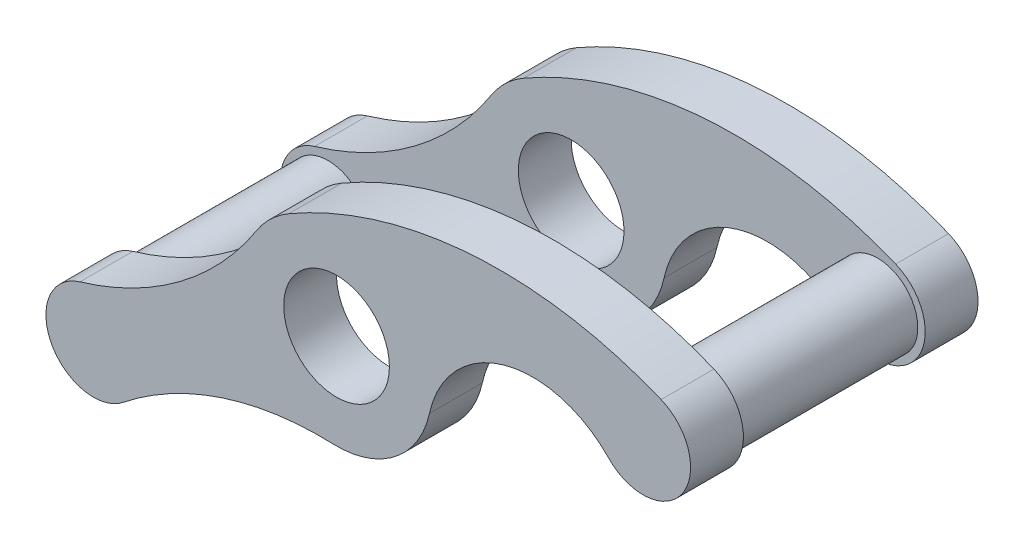
ISO-10303-21;
HEADER;
FILE_DESCRIPTION(('STEP AP214'),'2;1');
FILE_NAME('part.step','',(''),(''),'','','');
FILE_SCHEMA(('AUTOMOTIVE_DESIGN { 1 0 10303 214 1 1 1 1 }'));
ENDSEC;
DATA;
#1=APPLICATION_CONTEXT('core data for automotive mechanical design processes');
#2=APPLICATION_PROTOCOL_DEFINITION('international standard','automotive_design',2000,#1);
#3=PRODUCT_CONTEXT('',#1,'mechanical');
#4=PRODUCT('Part','Part','',(#3));
#5=PRODUCT_RELATED_PRODUCT_CATEGORY('part','',(#4));
#6=PRODUCT_DEFINITION_FORMATION('','',#4);
#7=PRODUCT_DEFINITION_CONTEXT('part definition',#1,'design');
#8=PRODUCT_DEFINITION('design','',#6,#7);
#9=PRODUCT_DEFINITION_SHAPE('','',#8);
#10=(LENGTH_UNIT() NAMED_UNIT(*) SI_UNIT(.MILLI.,.METRE.));
#11=(NAMED_UNIT(*) PLANE_ANGLE_UNIT() SI_UNIT($,.RADIAN.));
#12=(NAMED_UNIT(*) SI_UNIT($,.STERADIAN.) SOLID_ANGLE_UNIT());
#13=UNCERTAINTY_MEASURE_WITH_UNIT(LENGTH_MEASURE(1.E-05),#10,'distance_accuracy_value','');
#14=(GEOMETRIC_REPRESENTATION_CONTEXT(3) GLOBAL_UNCERTAINTY_ASSIGNED_CONTEXT((#13)) GLOBAL_UNIT_ASSIGNED_CONTEXT((#10,
#11,#12)) REPRESENTATION_CONTEXT('',''));
#15=CARTESIAN_POINT('',(0.,0.,0.));
#16=DIRECTION('',(0.,0.,1.));
#17=DIRECTION('',(1.,0.,0.));
#18=AXIS2_PLACEMENT_3D('',#15,#16,#17);
#19=CARTESIAN_POINT('',(-8.20396432467236,5.26853578895534,2.5));
#20=DIRECTION('',(0.,0.,1.));
#21=DIRECTION('',(1.,0.,0.));
#22=AXIS2_PLACEMENT_3D('',#19,#20,#21);
#23=PLANE('',#22);
#24=CARTESIAN_POINT('',(14.5,3.,2.5));
#25=DIRECTION('',(0.,0.,1.));
#26=DIRECTION('',(1.,0.,0.));
#27=AXIS2_PLACEMENT_3D('',#24,#25,#26);
#28=CIRCLE('',#27,1.9);
#29=CARTESIAN_POINT('',(12.6,3.,2.5));
#30=VERTEX_POINT('',#29);
#31=EDGE_CURVE('E194',#30,#30,#28,.T.);
#32=ORIENTED_EDGE('',*,*,#31,.F.);
#33=EDGE_LOOP('',(#32));
#34=FACE_BOUND('',#33,.T.);
#35=CARTESIAN_POINT('',(-11.5,-6.,2.5));
#36=DIRECTION('',(0.,0.,1.));
#37=DIRECTION('',(1.,0.,0.));
#38=AXIS2_PLACEMENT_3D('',#35,#36,#37);
#39=CIRCLE('',#38,1.9);
#40=CARTESIAN_POINT('',(-13.4,-6.,2.5));
#41=VERTEX_POINT('',#40);
#42=EDGE_CURVE('E188',#41,#41,#39,.T.);
#43=ORIENTED_EDGE('',*,*,#42,.F.);
#44=EDGE_LOOP('',(#43));
#45=FACE_BOUND('',#44,.T.);
#46=CARTESIAN_POINT('',(-16.4079286493447,10.5370715779107,2.5));
#47=DIRECTION('',(0.,0.,-1.));
#48=DIRECTION('',(1.,0.,0.));
#49=AXIS2_PLACEMENT_3D('',#46,#47,#48);
#50=CIRCLE('',#49,15.);
#51=CARTESIAN_POINT('',(-3.7864450729257,2.43163190259477,2.5));
#52=VERTEX_POINT('',#51);
#53=CARTESIAN_POINT('',(-12.1401646064363,-3.84299066375078,2.5));
#54=VERTEX_POINT('',#53);
#55=EDGE_CURVE('E148',#52,#54,#50,.T.);
#56=ORIENTED_EDGE('',*,*,#55,.T.);
#57=CARTESIAN_POINT('',(-11.5,-6.,2.5));
#58=DIRECTION('',(0.,0.,1.));
#59=DIRECTION('',(1.,0.,0.));
#60=AXIS2_PLACEMENT_3D('',#57,#58,#59);
#61=CIRCLE('',#60,2.25);
#62=CARTESIAN_POINT('',(-10.0970196431923,-7.75901850996845,2.5));
#63=VERTEX_POINT('',#62);
#64=EDGE_CURVE('E93',#54,#63,#61,.T.);
#65=ORIENTED_EDGE('',*,*,#64,.T.);
#66=CARTESIAN_POINT('',(-0.743817264474018,-19.4858085764248,2.5));
#67=DIRECTION('',(0.,0.,-1.));
#68=DIRECTION('',(1.,0.,0.));
#69=AXIS2_PLACEMENT_3D('',#66,#67,#68);
#70=CIRCLE('',#69,15.);
#71=CARTESIAN_POINT('',(-0.171650137955542,-4.49672505609803,2.5));
#72=VERTEX_POINT('',#71);
#73=EDGE_CURVE('E163',#63,#72,#70,.T.);
#74=ORIENTED_EDGE('',*,*,#73,.T.);
#75=CARTESIAN_POINT('',(0.,0.,2.5));
#76=DIRECTION('',(0.,0.,1.));
#77=DIRECTION('',(1.,0.,0.));
#78=AXIS2_PLACEMENT_3D('',#75,#76,#77);
#79=CIRCLE('',#78,4.5);
#80=CARTESIAN_POINT('',(4.39590119601776,-0.962316307068316,2.5));
#81=VERTEX_POINT('',#80);
#82=EDGE_CURVE('E176',#72,#81,#79,.T.);
#83=ORIENTED_EDGE('',*,*,#82,.T.);
#84=CARTESIAN_POINT('',(9.28023585825972,-2.03155664825533,2.5));
#85=DIRECTION('',(0.,0.,-1.));
#86=DIRECTION('',(1.,0.,0.));
#87=AXIS2_PLACEMENT_3D('',#84,#85,#86);
#88=CIRCLE('',#87,5.);
#89=CARTESIAN_POINT('',(12.8800731973909,1.43848241950697,2.5));
#90=VERTEX_POINT('',#89);
#91=EDGE_CURVE('E115',#81,#90,#88,.T.);
#92=ORIENTED_EDGE('',*,*,#91,.T.);
#93=CARTESIAN_POINT('',(14.5,3.,2.5));
#94=DIRECTION('',(0.,0.,1.));
#95=DIRECTION('',(1.,0.,0.));
#96=AXIS2_PLACEMENT_3D('',#93,#94,#95);
#97=CIRCLE('',#96,2.25);
#98=CARTESIAN_POINT('',(15.3547441393792,5.08132468783632,2.5));
#99=VERTEX_POINT('',#98);
#100=EDGE_CURVE('E109',#90,#99,#97,.T.);
#101=ORIENTED_EDGE('',*,*,#100,.T.);
#102=CARTESIAN_POINT('',(7.7570184560087,-13.4193392040421,2.5));
#103=DIRECTION('',(0.,0.,1.));
#104=DIRECTION('',(1.,0.,0.));
#105=AXIS2_PLACEMENT_3D('',#102,#103,#104);
#106=CIRCLE('',#105,20.);
#107=CARTESIAN_POINT('',(-2.25203761626059,3.89593718827027,2.5));
#108=VERTEX_POINT('',#107);
#109=EDGE_CURVE('E113',#99,#108,#106,.T.);
#110=ORIENTED_EDGE('',*,*,#109,.T.);
#111=CARTESIAN_POINT('',(0.,0.,2.5));
#112=DIRECTION('',(0.,0.,1.));
#113=DIRECTION('',(1.,0.,0.));
#114=AXIS2_PLACEMENT_3D('',#111,#112,#113);
#115=CIRCLE('',#114,4.5);
#116=EDGE_CURVE('E49',#108,#52,#115,.T.);
#117=ORIENTED_EDGE('',*,*,#116,.T.);
#118=EDGE_LOOP('',(#56,#65,#74,#83,#92,#101,#110,#117));
#119=FACE_BOUND('',#118,.T.);
#120=CARTESIAN_POINT('',(0.,0.,2.5));
#121=DIRECTION('',(0.,0.,1.));
#122=DIRECTION('',(1.,0.,0.));
#123=AXIS2_PLACEMENT_3D('',#120,#121,#122);
#124=CIRCLE('',#123,2.5);
#125=CARTESIAN_POINT('',(2.5,0.,2.5));
#126=VERTEX_POINT('',#125);
#127=EDGE_CURVE('E137',#126,#126,#124,.T.);
#128=ORIENTED_EDGE('',*,*,#127,.F.);
#129=EDGE_LOOP('',(#128));
#130=FACE_BOUND('',#129,.T.);
#131=ADVANCED_FACE('F32',(#34,#45,#119,#130),#23,.T.);
#132=CARTESIAN_POINT('',(-8.20396432467236,5.26853578895534,0.));
#133=DIRECTION('',(0.,0.,1.));
#134=DIRECTION('',(1.,0.,0.));
#135=AXIS2_PLACEMENT_3D('',#132,#133,#134);
#136=PLANE('',#135);
#137=CARTESIAN_POINT('',(-16.4079286493447,10.5370715779107,0.));
#138=DIRECTION('',(0.,0.,-1.));
#139=DIRECTION('',(1.,0.,0.));
#140=AXIS2_PLACEMENT_3D('',#137,#138,#139);
#141=CIRCLE('',#140,15.);
#142=CARTESIAN_POINT('',(-3.7864450729257,2.43163190259477,0.));
#143=VERTEX_POINT('',#142);
#144=CARTESIAN_POINT('',(-12.1401646064363,-3.84299066375078,0.));
#145=VERTEX_POINT('',#144);
#146=EDGE_CURVE('E133',#143,#145,#141,.T.);
#147=ORIENTED_EDGE('',*,*,#146,.F.);
#148=CARTESIAN_POINT('',(0.,0.,0.));
#149=DIRECTION('',(0.,0.,1.));
#150=DIRECTION('',(1.,0.,0.));
#151=AXIS2_PLACEMENT_3D('',#148,#149,#150);
#152=CIRCLE('',#151,4.5);
#153=CARTESIAN_POINT('',(-2.25203761626059,3.89593718827027,0.));
#154=VERTEX_POINT('',#153);
#155=EDGE_CURVE('E85',#154,#143,#152,.T.);
#156=ORIENTED_EDGE('',*,*,#155,.F.);
#157=CARTESIAN_POINT('',(7.7570184560087,-13.4193392040421,0.));
#158=DIRECTION('',(0.,0.,1.));
#159=DIRECTION('',(1.,0.,0.));
#160=AXIS2_PLACEMENT_3D('',#157,#158,#159);
#161=CIRCLE('',#160,20.);
#162=CARTESIAN_POINT('',(15.3547441393792,5.08132468783632,0.));
#163=VERTEX_POINT('',#162);
#164=EDGE_CURVE('E79',#163,#154,#161,.T.);
#165=ORIENTED_EDGE('',*,*,#164,.F.);
#166=CARTESIAN_POINT('',(14.5,3.,0.));
#167=DIRECTION('',(0.,0.,1.));
#168=DIRECTION('',(1.,0.,0.));
#169=AXIS2_PLACEMENT_3D('',#166,#167,#168);
#170=CIRCLE('',#169,2.25);
#171=CARTESIAN_POINT('',(12.8800731973909,1.43848241950697,0.));
#172=VERTEX_POINT('',#171);
#173=EDGE_CURVE('E123',#172,#163,#170,.T.);
#174=ORIENTED_EDGE('',*,*,#173,.F.);
#175=CARTESIAN_POINT('',(9.28023585825972,-2.03155664825533,0.));
#176=DIRECTION('',(0.,0.,-1.));
#177=DIRECTION('',(1.,0.,0.));
#178=AXIS2_PLACEMENT_3D('',#175,#176,#177);
#179=CIRCLE('',#178,5.);
#180=CARTESIAN_POINT('',(4.39590119601776,-0.962316307068316,0.));
#181=VERTEX_POINT('',#180);
#182=EDGE_CURVE('E143',#181,#172,#179,.T.);
#183=ORIENTED_EDGE('',*,*,#182,.F.);
#184=CARTESIAN_POINT('',(0.,0.,0.));
#185=DIRECTION('',(0.,0.,1.));
#186=DIRECTION('',(1.,0.,0.));
#187=AXIS2_PLACEMENT_3D('',#184,#185,#186);
#188=CIRCLE('',#187,4.5);
#189=CARTESIAN_POINT('',(-0.171650137955542,-4.49672505609803,0.));
#190=VERTEX_POINT('',#189);
#191=EDGE_CURVE('E141',#190,#181,#188,.T.);
#192=ORIENTED_EDGE('',*,*,#191,.F.);
#193=CARTESIAN_POINT('',(-0.743817264474018,-19.4858085764248,0.));
#194=DIRECTION('',(0.,0.,-1.));
#195=DIRECTION('',(1.,0.,0.));
#196=AXIS2_PLACEMENT_3D('',#193,#194,#195);
#197=CIRCLE('',#196,15.);
#198=CARTESIAN_POINT('',(-10.0970196431923,-7.75901850996845,0.));
#199=VERTEX_POINT('',#198);
#200=EDGE_CURVE('E139',#199,#190,#197,.T.);
#201=ORIENTED_EDGE('',*,*,#200,.F.);
#202=CARTESIAN_POINT('',(-11.5,-6.,0.));
#203=DIRECTION('',(0.,0.,1.));
#204=DIRECTION('',(1.,0.,0.));
#205=AXIS2_PLACEMENT_3D('',#202,#203,#204);
#206=CIRCLE('',#205,2.25);
#207=EDGE_CURVE('E136',#145,#199,#206,.T.);
#208=ORIENTED_EDGE('',*,*,#207,.F.);
#209=EDGE_LOOP('',(#147,#156,#165,#174,#183,#192,#201,#208));
#210=FACE_BOUND('',#209,.T.);
#211=CARTESIAN_POINT('',(0.,0.,0.));
#212=DIRECTION('',(0.,0.,1.));
#213=DIRECTION('',(1.,0.,0.));
#214=AXIS2_PLACEMENT_3D('',#211,#212,#213);
#215=CIRCLE('',#214,2.5);
#216=CARTESIAN_POINT('',(2.5,0.,0.));
#217=VERTEX_POINT('',#216);
#218=EDGE_CURVE('E182',#217,#217,#215,.T.);
#219=ORIENTED_EDGE('',*,*,#218,.T.);
#220=EDGE_LOOP('',(#219));
#221=FACE_BOUND('',#220,.T.);
#222=ADVANCED_FACE('F167',(#210,#221),#136,.F.);
#223=CARTESIAN_POINT('',(-16.4079286493447,10.5370715779107,2.5));
#224=DIRECTION('',(0.,0.,-1.));
#225=DIRECTION('',(-1.,0.,0.));
#226=AXIS2_PLACEMENT_3D('',#223,#224,#225);
#227=CYLINDRICAL_SURFACE('',#226,15.);
#228=ORIENTED_EDGE('',*,*,#146,.T.);
#229=DIRECTION('',(0.,0.,-1.));
#230=VECTOR('',#229,1.);
#231=CARTESIAN_POINT('',(-12.1401646064363,-3.84299066375078,2.5));
#232=LINE('',#231,#230);
#233=EDGE_CURVE('E11',#54,#145,#232,.T.);
#234=ORIENTED_EDGE('',*,*,#233,.F.);
#235=ORIENTED_EDGE('',*,*,#55,.F.);
#236=DIRECTION('',(0.,0.,-1.));
#237=VECTOR('',#236,1.);
#238=CARTESIAN_POINT('',(-3.7864450729257,2.43163190259477,2.5));
#239=LINE('',#238,#237);
#240=EDGE_CURVE('E129',#52,#143,#239,.T.);
#241=ORIENTED_EDGE('',*,*,#240,.T.);
#242=EDGE_LOOP('',(#228,#234,#235,#241));
#243=FACE_BOUND('',#242,.T.);
#244=ADVANCED_FACE('F34',(#243),#227,.F.);
#245=CARTESIAN_POINT('',(-11.5,-6.,2.5));
#246=DIRECTION('',(0.,0.,-1.));
#247=DIRECTION('',(-1.,0.,0.));
#248=AXIS2_PLACEMENT_3D('',#245,#246,#247);
#249=CYLINDRICAL_SURFACE('',#248,2.25);
#250=ORIENTED_EDGE('',*,*,#207,.T.);
#251=DIRECTION('',(0.,0.,-1.));
#252=VECTOR('',#251,1.);
#253=CARTESIAN_POINT('',(-10.0970196431923,-7.75901850996845,2.5));
#254=LINE('',#253,#252);
#255=EDGE_CURVE('E41',#63,#199,#254,.T.);
#256=ORIENTED_EDGE('',*,*,#255,.F.);
#257=ORIENTED_EDGE('',*,*,#64,.F.);
#258=ORIENTED_EDGE('',*,*,#233,.T.);
#259=EDGE_LOOP('',(#250,#256,#257,#258));
#260=FACE_BOUND('',#259,.T.);
#261=ADVANCED_FACE('F323',(#260),#249,.T.);
#262=CARTESIAN_POINT('',(-0.743817264474018,-19.4858085764248,2.5));
#263=DIRECTION('',(0.,0.,-1.));
#264=DIRECTION('',(-1.,0.,0.));
#265=AXIS2_PLACEMENT_3D('',#262,#263,#264);
#266=CYLINDRICAL_SURFACE('',#265,15.);
#267=ORIENTED_EDGE('',*,*,#200,.T.);
#268=DIRECTION('',(0.,0.,-1.));
#269=VECTOR('',#268,1.);
#270=CARTESIAN_POINT('',(-0.171650137955542,-4.49672505609803,2.5));
#271=LINE('',#270,#269);
#272=EDGE_CURVE('E155',#72,#190,#271,.T.);
#273=ORIENTED_EDGE('',*,*,#272,.F.);
#274=ORIENTED_EDGE('',*,*,#73,.F.);
#275=ORIENTED_EDGE('',*,*,#255,.T.);
#276=EDGE_LOOP('',(#267,#273,#274,#275));
#277=FACE_BOUND('',#276,.T.);
#278=ADVANCED_FACE('F161',(#277),#266,.F.);
#279=CARTESIAN_POINT('',(0.,0.,2.5));
#280=DIRECTION('',(0.,0.,-1.));
#281=DIRECTION('',(-1.,0.,0.));
#282=AXIS2_PLACEMENT_3D('',#279,#280,#281);
#283=CYLINDRICAL_SURFACE('',#282,4.5);
#284=ORIENTED_EDGE('',*,*,#191,.T.);
#285=DIRECTION('',(0.,0.,-1.));
#286=VECTOR('',#285,1.);
#287=CARTESIAN_POINT('',(4.39590119601776,-0.962316307068316,2.5));
#288=LINE('',#287,#286);
#289=EDGE_CURVE('E152',#81,#181,#288,.T.);
#290=ORIENTED_EDGE('',*,*,#289,.F.);
#291=ORIENTED_EDGE('',*,*,#82,.F.);
#292=ORIENTED_EDGE('',*,*,#272,.T.);
#293=EDGE_LOOP('',(#284,#290,#291,#292));
#294=FACE_BOUND('',#293,.T.);
#295=ADVANCED_FACE('F172',(#294),#283,.T.);
#296=CARTESIAN_POINT('',(9.28023585825972,-2.03155664825533,2.5));
#297=DIRECTION('',(0.,0.,-1.));
#298=DIRECTION('',(-1.,0.,0.));
#299=AXIS2_PLACEMENT_3D('',#296,#297,#298);
#300=CYLINDRICAL_SURFACE('',#299,5.);
#301=ORIENTED_EDGE('',*,*,#182,.T.);
#302=DIRECTION('',(0.,0.,-1.));
#303=VECTOR('',#302,1.);
#304=CARTESIAN_POINT('',(12.8800731973909,1.43848241950697,2.5));
#305=LINE('',#304,#303);
#306=EDGE_CURVE('E124',#90,#172,#305,.T.);
#307=ORIENTED_EDGE('',*,*,#306,.F.);
#308=ORIENTED_EDGE('',*,*,#91,.F.);
#309=ORIENTED_EDGE('',*,*,#289,.T.);
#310=EDGE_LOOP('',(#301,#307,#308,#309));
#311=FACE_BOUND('',#310,.T.);
#312=ADVANCED_FACE('F175',(#311),#300,.F.);
#313=CARTESIAN_POINT('',(14.5,3.,2.5));
#314=DIRECTION('',(0.,0.,-1.));
#315=DIRECTION('',(-1.,0.,0.));
#316=AXIS2_PLACEMENT_3D('',#313,#314,#315);
#317=CYLINDRICAL_SURFACE('',#316,2.25);
#318=ORIENTED_EDGE('',*,*,#173,.T.);
#319=DIRECTION('',(0.,0.,-1.));
#320=VECTOR('',#319,1.);
#321=CARTESIAN_POINT('',(15.3547441393792,5.08132468783632,2.5));
#322=LINE('',#321,#320);
#323=EDGE_CURVE('E120',#99,#163,#322,.T.);
#324=ORIENTED_EDGE('',*,*,#323,.F.);
#325=ORIENTED_EDGE('',*,*,#100,.F.);
#326=ORIENTED_EDGE('',*,*,#306,.T.);
#327=EDGE_LOOP('',(#318,#324,#325,#326));
#328=FACE_BOUND('',#327,.T.);
#329=ADVANCED_FACE('F121',(#328),#317,.T.);
#330=CARTESIAN_POINT('',(7.7570184560087,-13.4193392040421,2.5));
#331=DIRECTION('',(0.,0.,-1.));
#332=DIRECTION('',(-1.,0.,0.));
#333=AXIS2_PLACEMENT_3D('',#330,#331,#332);
#334=CYLINDRICAL_SURFACE('',#333,20.);
#335=ORIENTED_EDGE('',*,*,#164,.T.);
#336=DIRECTION('',(0.,0.,-1.));
#337=VECTOR('',#336,1.);
#338=CARTESIAN_POINT('',(-2.25203761626059,3.89593718827027,2.5));
#339=LINE('',#338,#337);
#340=EDGE_CURVE('E125',#108,#154,#339,.T.);
#341=ORIENTED_EDGE('',*,*,#340,.F.);
#342=ORIENTED_EDGE('',*,*,#109,.F.);
#343=ORIENTED_EDGE('',*,*,#323,.T.);
#344=EDGE_LOOP('',(#335,#341,#342,#343));
#345=FACE_BOUND('',#344,.T.);
#346=ADVANCED_FACE('F127',(#345),#334,.T.);
#347=CARTESIAN_POINT('',(0.,0.,2.5));
#348=DIRECTION('',(0.,0.,-1.));
#349=DIRECTION('',(-1.,0.,0.));
#350=AXIS2_PLACEMENT_3D('',#347,#348,#349);
#351=CYLINDRICAL_SURFACE('',#350,4.5);
#352=ORIENTED_EDGE('',*,*,#155,.T.);
#353=ORIENTED_EDGE('',*,*,#240,.F.);
#354=ORIENTED_EDGE('',*,*,#116,.F.);
#355=ORIENTED_EDGE('',*,*,#340,.T.);
#356=EDGE_LOOP('',(#352,#353,#354,#355));
#357=FACE_BOUND('',#356,.T.);
#358=ADVANCED_FACE('F311',(#357),#351,.T.);
#359=CARTESIAN_POINT('',(0.,0.,2.5));
#360=DIRECTION('',(0.,0.,-1.));
#361=DIRECTION('',(-1.,0.,0.));
#362=AXIS2_PLACEMENT_3D('',#359,#360,#361);
#363=CYLINDRICAL_SURFACE('',#362,2.5);
#364=ORIENTED_EDGE('',*,*,#127,.T.);
#365=EDGE_LOOP('',(#364));
#366=FACE_BOUND('',#365,.T.);
#367=ORIENTED_EDGE('',*,*,#218,.F.);
#368=EDGE_LOOP('',(#367));
#369=FACE_BOUND('',#368,.T.);
#370=ADVANCED_FACE('F308',(#366,#369),#363,.F.);
#371=CARTESIAN_POINT('',(-11.5,-6.,11.1));
#372=DIRECTION('',(0.,0.,-1.));
#373=DIRECTION('',(-1.,0.,0.));
#374=AXIS2_PLACEMENT_3D('',#371,#372,#373);
#375=CYLINDRICAL_SURFACE('',#374,1.9);
#376=CARTESIAN_POINT('',(-11.5,-6.,11.1));
#377=DIRECTION('',(0.,0.,1.));
#378=DIRECTION('',(1.,0.,0.));
#379=AXIS2_PLACEMENT_3D('',#376,#377,#378);
#380=CIRCLE('',#379,1.9);
#381=CARTESIAN_POINT('',(-13.4,-6.,11.1));
#382=VERTEX_POINT('',#381);
#383=EDGE_CURVE('E185',#382,#382,#380,.T.);
#384=CARTESIAN_POINT('',(-13.4,-6.,11.1));
#385=CARTESIAN_POINT('',(-13.4,-6.,11.0104166666667));
#386=CARTESIAN_POINT('',(-13.4,-6.,10.9208333333333));
#387=CARTESIAN_POINT('',(-13.4,-6.,10.7416666666667));
#388=CARTESIAN_POINT('',(-13.4,-6.,10.6520833333333));
#389=CARTESIAN_POINT('',(-13.4,-6.,10.4729166666667));
#390=CARTESIAN_POINT('',(-13.4,-6.,10.3833333333333));
#391=CARTESIAN_POINT('',(-13.4,-6.,10.2041666666667));
#392=CARTESIAN_POINT('',(-13.4,-6.,10.1145833333333));
#393=CARTESIAN_POINT('',(-13.4,-6.,9.93541666666667));
#394=CARTESIAN_POINT('',(-13.4,-6.,9.84583333333333));
#395=CARTESIAN_POINT('',(-13.4,-6.,9.66666666666667));
#396=CARTESIAN_POINT('',(-13.4,-6.,9.57708333333333));
#397=CARTESIAN_POINT('',(-13.4,-6.,9.39791666666667));
#398=CARTESIAN_POINT('',(-13.4,-6.,9.30833333333333));
#399=CARTESIAN_POINT('',(-13.4,-6.,9.12916666666667));
#400=CARTESIAN_POINT('',(-13.4,-6.,9.03958333333333));
#401=CARTESIAN_POINT('',(-13.4,-6.,8.86041666666667));
#402=CARTESIAN_POINT('',(-13.4,-6.,8.77083333333333));
#403=CARTESIAN_POINT('',(-13.4,-6.,8.59166666666667));
#404=CARTESIAN_POINT('',(-13.4,-6.,8.50208333333333));
#405=CARTESIAN_POINT('',(-13.4,-6.,8.32291666666667));
#406=CARTESIAN_POINT('',(-13.4,-6.,8.23333333333333));
#407=CARTESIAN_POINT('',(-13.4,-6.,8.05416666666666));
#408=CARTESIAN_POINT('',(-13.4,-6.,7.96458333333333));
#409=CARTESIAN_POINT('',(-13.4,-6.,7.78541666666667));
#410=CARTESIAN_POINT('',(-13.4,-6.,7.69583333333333));
#411=CARTESIAN_POINT('',(-13.4,-6.,7.51666666666667));
#412=CARTESIAN_POINT('',(-13.4,-6.,7.42708333333333));
#413=CARTESIAN_POINT('',(-13.4,-6.,7.24791666666667));
#414=CARTESIAN_POINT('',(-13.4,-6.,7.15833333333333));
#415=CARTESIAN_POINT('',(-13.4,-6.,6.97916666666667));
#416=CARTESIAN_POINT('',(-13.4,-6.,6.88958333333333));
#417=CARTESIAN_POINT('',(-13.4,-6.,6.71041666666667));
#418=CARTESIAN_POINT('',(-13.4,-6.,6.62083333333333));
#419=CARTESIAN_POINT('',(-13.4,-6.,6.44166666666667));
#420=CARTESIAN_POINT('',(-13.4,-6.,6.35208333333333));
#421=CARTESIAN_POINT('',(-13.4,-6.,6.17291666666666));
#422=CARTESIAN_POINT('',(-13.4,-6.,6.08333333333333));
#423=CARTESIAN_POINT('',(-13.4,-6.,5.90416666666667));
#424=CARTESIAN_POINT('',(-13.4,-6.,5.81458333333333));
#425=CARTESIAN_POINT('',(-13.4,-6.,5.63541666666667));
#426=CARTESIAN_POINT('',(-13.4,-6.,5.54583333333333));
#427=CARTESIAN_POINT('',(-13.4,-6.,5.36666666666666));
#428=CARTESIAN_POINT('',(-13.4,-6.,5.27708333333333));
#429=CARTESIAN_POINT('',(-13.4,-6.,5.09791666666666));
#430=CARTESIAN_POINT('',(-13.4,-6.,5.00833333333333));
#431=CARTESIAN_POINT('',(-13.4,-6.,4.82916666666666));
#432=CARTESIAN_POINT('',(-13.4,-6.,4.73958333333333));
#433=CARTESIAN_POINT('',(-13.4,-6.,4.56041666666667));
#434=CARTESIAN_POINT('',(-13.4,-6.,4.47083333333333));
#435=CARTESIAN_POINT('',(-13.4,-6.,4.29166666666667));
#436=CARTESIAN_POINT('',(-13.4,-6.,4.20208333333333));
#437=CARTESIAN_POINT('',(-13.4,-6.,4.02291666666666));
#438=CARTESIAN_POINT('',(-13.4,-6.,3.93333333333333));
#439=CARTESIAN_POINT('',(-13.4,-6.,3.75416666666666));
#440=CARTESIAN_POINT('',(-13.4,-6.,3.66458333333333));
#441=CARTESIAN_POINT('',(-13.4,-6.,3.48541666666666));
#442=CARTESIAN_POINT('',(-13.4,-6.,3.39583333333333));
#443=CARTESIAN_POINT('',(-13.4,-6.,3.21666666666666));
#444=CARTESIAN_POINT('',(-13.4,-6.,3.12708333333333));
#445=CARTESIAN_POINT('',(-13.4,-6.,2.94791666666667));
#446=CARTESIAN_POINT('',(-13.4,-6.,2.85833333333333));
#447=CARTESIAN_POINT('',(-13.4,-6.,2.67916666666667));
#448=CARTESIAN_POINT('',(-13.4,-6.,2.58958333333333));
#449=CARTESIAN_POINT('',(-13.4,-6.,2.5));
#450=B_SPLINE_CURVE_WITH_KNOTS('',3,(#384,#385,#386,#387,#388,#389,#390,#391,#392,#393,#394,
#395,#396,#397,#398,#399,#400,#401,#402,#403,#404,#405,#406,#407,#408,#409,#410,#411,#412,#413,
#414,#415,#416,#417,#418,#419,#420,#421,#422,#423,#424,#425,#426,#427,#428,#429,#430,#431,#432,
#433,#434,#435,#436,#437,#438,#439,#440,#441,#442,#443,#444,#445,#446,#447,#448,#449),
.UNSPECIFIED.,.F.,.F.,(4,2,2,2,2,2,2,2,2,2,2,2,2,2,2,2,2,2,2,2,2,2,2,2,2,2,2,2,2,2,2,2,4),(0.,
0.268750000000002,0.537500000000002,0.806250000000001,1.075,1.34375,1.6125,1.88125,2.15,2.41875,
2.6875,2.95625,3.225,3.49375,3.7625,4.03125,4.3,4.56875,4.8375,5.10625,5.375,5.64375,5.9125,
6.18125,6.45,6.71875,6.9875,7.25625,7.525,7.79375,8.0625,8.33125,8.6),.UNSPECIFIED.);
#451=EDGE_CURVE('BSEAM294',#382,#41,#450,.T.);
#452=ORIENTED_EDGE('',*,*,#383,.F.);
#453=ORIENTED_EDGE('',*,*,#42,.T.);
#454=ORIENTED_EDGE('',*,*,#451,.T.);
#455=ORIENTED_EDGE('',*,*,#451,.F.);
#456=EDGE_LOOP('',(#452,#454,#453,#455));
#457=FACE_BOUND('',#456,.T.);
#458=ADVANCED_FACE('F294',(#457),#375,.T.);
#459=CARTESIAN_POINT('',(14.5,3.,11.1));
#460=DIRECTION('',(0.,0.,-1.));
#461=DIRECTION('',(-1.,0.,0.));
#462=AXIS2_PLACEMENT_3D('',#459,#460,#461);
#463=CYLINDRICAL_SURFACE('',#462,1.9);
#464=CARTESIAN_POINT('',(14.5,3.,11.1));
#465=DIRECTION('',(0.,0.,1.));
#466=DIRECTION('',(1.,0.,0.));
#467=AXIS2_PLACEMENT_3D('',#464,#465,#466);
#468=CIRCLE('',#467,1.9);
#469=CARTESIAN_POINT('',(12.6,3.,11.1));
#470=VERTEX_POINT('',#469);
#471=EDGE_CURVE('E191',#470,#470,#468,.T.);
#472=CARTESIAN_POINT('',(12.6,3.,11.1));
#473=CARTESIAN_POINT('',(12.6,3.,11.0104166666667));
#474=CARTESIAN_POINT('',(12.6,3.,10.9208333333333));
#475=CARTESIAN_POINT('',(12.6,3.,10.7416666666667));
#476=CARTESIAN_POINT('',(12.6,3.,10.6520833333333));
#477=CARTESIAN_POINT('',(12.6,3.,10.4729166666667));
#478=CARTESIAN_POINT('',(12.6,3.,10.3833333333333));
#479=CARTESIAN_POINT('',(12.6,3.,10.2041666666667));
#480=CARTESIAN_POINT('',(12.6,3.,10.1145833333333));
#481=CARTESIAN_POINT('',(12.6,3.,9.93541666666667));
#482=CARTESIAN_POINT('',(12.6,3.,9.84583333333333));
#483=CARTESIAN_POINT('',(12.6,3.,9.66666666666667));
#484=CARTESIAN_POINT('',(12.6,3.,9.57708333333333));
#485=CARTESIAN_POINT('',(12.6,3.,9.39791666666667));
#486=CARTESIAN_POINT('',(12.6,3.,9.30833333333333));
#487=CARTESIAN_POINT('',(12.6,3.,9.12916666666667));
#488=CARTESIAN_POINT('',(12.6,3.,9.03958333333333));
#489=CARTESIAN_POINT('',(12.6,3.,8.86041666666667));
#490=CARTESIAN_POINT('',(12.6,3.,8.77083333333333));
#491=CARTESIAN_POINT('',(12.6,3.,8.59166666666667));
#492=CARTESIAN_POINT('',(12.6,3.,8.50208333333333));
#493=CARTESIAN_POINT('',(12.6,3.,8.32291666666667));
#494=CARTESIAN_POINT('',(12.6,3.,8.23333333333333));
#495=CARTESIAN_POINT('',(12.6,3.,8.05416666666666));
#496=CARTESIAN_POINT('',(12.6,3.,7.96458333333333));
#497=CARTESIAN_POINT('',(12.6,3.,7.78541666666667));
#498=CARTESIAN_POINT('',(12.6,3.,7.69583333333333));
#499=CARTESIAN_POINT('',(12.6,3.,7.51666666666667));
#500=CARTESIAN_POINT('',(12.6,3.,7.42708333333333));
#501=CARTESIAN_POINT('',(12.6,3.,7.24791666666667));
#502=CARTESIAN_POINT('',(12.6,3.,7.15833333333333));
#503=CARTESIAN_POINT('',(12.6,3.,6.97916666666667));
#504=CARTESIAN_POINT('',(12.6,3.,6.88958333333333));
#505=CARTESIAN_POINT('',(12.6,3.,6.71041666666667));
#506=CARTESIAN_POINT('',(12.6,3.,6.62083333333333));
#507=CARTESIAN_POINT('',(12.6,3.,6.44166666666667));
#508=CARTESIAN_POINT('',(12.6,3.,6.35208333333333));
#509=CARTESIAN_POINT('',(12.6,3.,6.17291666666666));
#510=CARTESIAN_POINT('',(12.6,3.,6.08333333333333));
#511=CARTESIAN_POINT('',(12.6,3.,5.90416666666667));
#512=CARTESIAN_POINT('',(12.6,3.,5.81458333333333));
#513=CARTESIAN_POINT('',(12.6,3.,5.63541666666667));
#514=CARTESIAN_POINT('',(12.6,3.,5.54583333333333));
#515=CARTESIAN_POINT('',(12.6,3.,5.36666666666666));
#516=CARTESIAN_POINT('',(12.6,3.,5.27708333333333));
#517=CARTESIAN_POINT('',(12.6,3.,5.09791666666666));
#518=CARTESIAN_POINT('',(12.6,3.,5.00833333333333));
#519=CARTESIAN_POINT('',(12.6,3.,4.82916666666666));
#520=CARTESIAN_POINT('',(12.6,3.,4.73958333333333));
#521=CARTESIAN_POINT('',(12.6,3.,4.56041666666667));
#522=CARTESIAN_POINT('',(12.6,3.,4.47083333333333));
#523=CARTESIAN_POINT('',(12.6,3.,4.29166666666667));
#524=CARTESIAN_POINT('',(12.6,3.,4.20208333333333));
#525=CARTESIAN_POINT('',(12.6,3.,4.02291666666666));
#526=CARTESIAN_POINT('',(12.6,3.,3.93333333333333));
#527=CARTESIAN_POINT('',(12.6,3.,3.75416666666666));
#528=CARTESIAN_POINT('',(12.6,3.,3.66458333333333));
#529=CARTESIAN_POINT('',(12.6,3.,3.48541666666666));
#530=CARTESIAN_POINT('',(12.6,3.,3.39583333333333));
#531=CARTESIAN_POINT('',(12.6,3.,3.21666666666666));
#532=CARTESIAN_POINT('',(12.6,3.,3.12708333333333));
#533=CARTESIAN_POINT('',(12.6,3.,2.94791666666667));
#534=CARTESIAN_POINT('',(12.6,3.,2.85833333333333));
#535=CARTESIAN_POINT('',(12.6,3.,2.67916666666667));
#536=CARTESIAN_POINT('',(12.6,3.,2.58958333333333));
#537=CARTESIAN_POINT('',(12.6,3.,2.5));
#538=B_SPLINE_CURVE_WITH_KNOTS('',3,(#472,#473,#474,#475,#476,#477,#478,#479,#480,#481,#482,
#483,#484,#485,#486,#487,#488,#489,#490,#491,#492,#493,#494,#495,#496,#497,#498,#499,#500,#501,
#502,#503,#504,#505,#506,#507,#508,#509,#510,#511,#512,#513,#514,#515,#516,#517,#518,#519,#520,
#521,#522,#523,#524,#525,#526,#527,#528,#529,#530,#531,#532,#533,#534,#535,#536,#537),
.UNSPECIFIED.,.F.,.F.,(4,2,2,2,2,2,2,2,2,2,2,2,2,2,2,2,2,2,2,2,2,2,2,2,2,2,2,2,2,2,2,2,4),(0.,
0.268750000000002,0.537500000000002,0.806250000000001,1.075,1.34375,1.6125,1.88125,2.15,2.41875,
2.6875,2.95625,3.225,3.49375,3.7625,4.03125,4.3,4.56875,4.8375,5.10625,5.375,5.64375,5.9125,
6.18125,6.45,6.71875,6.9875,7.25625,7.525,7.79375,8.0625,8.33125,8.6),.UNSPECIFIED.);
#539=EDGE_CURVE('BSEAM284',#470,#30,#538,.T.);
#540=ORIENTED_EDGE('',*,*,#471,.F.);
#541=ORIENTED_EDGE('',*,*,#31,.T.);
#542=ORIENTED_EDGE('',*,*,#539,.T.);
#543=ORIENTED_EDGE('',*,*,#539,.F.);
#544=EDGE_LOOP('',(#540,#542,#541,#543));
#545=FACE_BOUND('',#544,.T.);
#546=ADVANCED_FACE('F284',(#545),#463,.T.);
#547=CARTESIAN_POINT('',(4.64011792912986,-1.01577832412766,13.6));
#548=DIRECTION('',(0.,0.,1.));
#549=DIRECTION('',(1.,0.,0.));
#550=AXIS2_PLACEMENT_3D('',#547,#548,#549);
#551=PLANE('',#550);
#552=CARTESIAN_POINT('',(9.28023585825972,-2.03155664825533,13.6));
#553=DIRECTION('',(0.,0.,-1.));
#554=DIRECTION('',(1.,0.,0.));
#555=AXIS2_PLACEMENT_3D('',#552,#553,#554);
#556=CIRCLE('',#555,5.);
#557=CARTESIAN_POINT('',(4.39590119601776,-0.962316307068316,13.6));
#558=VERTEX_POINT('',#557);
#559=CARTESIAN_POINT('',(12.880073197391,1.43848241950697,13.6));
#560=VERTEX_POINT('',#559);
#561=EDGE_CURVE('E227',#558,#560,#556,.T.);
#562=ORIENTED_EDGE('',*,*,#561,.T.);
#563=CARTESIAN_POINT('',(14.5,3.,13.6));
#564=DIRECTION('',(0.,0.,1.));
#565=DIRECTION('',(1.,0.,0.));
#566=AXIS2_PLACEMENT_3D('',#563,#564,#565);
#567=CIRCLE('',#566,2.25);
#568=CARTESIAN_POINT('',(15.3547441393792,5.08132468783632,13.6));
#569=VERTEX_POINT('',#568);
#570=EDGE_CURVE('E267',#560,#569,#567,.T.);
#571=ORIENTED_EDGE('',*,*,#570,.T.);
#572=CARTESIAN_POINT('',(7.7570184560087,-13.4193392040421,13.6));
#573=DIRECTION('',(0.,0.,1.));
#574=DIRECTION('',(1.,0.,0.));
#575=AXIS2_PLACEMENT_3D('',#572,#573,#574);
#576=CIRCLE('',#575,20.);
#577=CARTESIAN_POINT('',(-2.25203761626059,3.89593718827027,13.6));
#578=VERTEX_POINT('',#577);
#579=EDGE_CURVE('E264',#569,#578,#576,.T.);
#580=ORIENTED_EDGE('',*,*,#579,.T.);
#581=CARTESIAN_POINT('',(0.,0.,13.6));
#582=DIRECTION('',(0.,0.,1.));
#583=DIRECTION('',(1.,0.,0.));
#584=AXIS2_PLACEMENT_3D('',#581,#582,#583);
#585=CIRCLE('',#584,4.5);
#586=CARTESIAN_POINT('',(-3.7864450729257,2.43163190259477,13.6));
#587=VERTEX_POINT('',#586);
#588=EDGE_CURVE('E261',#578,#587,#585,.T.);
#589=ORIENTED_EDGE('',*,*,#588,.T.);
#590=CARTESIAN_POINT('',(-16.4079286493447,10.5370715779107,13.6));
#591=DIRECTION('',(0.,0.,-1.));
#592=DIRECTION('',(1.,0.,0.));
#593=AXIS2_PLACEMENT_3D('',#590,#591,#592);
#594=CIRCLE('',#593,15.);
#595=CARTESIAN_POINT('',(-12.1401646064363,-3.84299066375078,13.6));
#596=VERTEX_POINT('',#595);
#597=EDGE_CURVE('E258',#587,#596,#594,.T.);
#598=ORIENTED_EDGE('',*,*,#597,.T.);
#599=CARTESIAN_POINT('',(-11.5,-6.,13.6));
#600=DIRECTION('',(0.,0.,1.));
#601=DIRECTION('',(1.,0.,0.));
#602=AXIS2_PLACEMENT_3D('',#599,#600,#601);
#603=CIRCLE('',#602,2.25);
#604=CARTESIAN_POINT('',(-10.0970196431923,-7.75901850996845,13.6));
#605=VERTEX_POINT('',#604);
#606=EDGE_CURVE('E255',#596,#605,#603,.T.);
#607=ORIENTED_EDGE('',*,*,#606,.T.);
#608=CARTESIAN_POINT('',(-0.743817264474018,-19.4858085764248,13.6));
#609=DIRECTION('',(0.,0.,-1.));
#610=DIRECTION('',(1.,0.,0.));
#611=AXIS2_PLACEMENT_3D('',#608,#609,#610);
#612=CIRCLE('',#611,15.);
#613=CARTESIAN_POINT('',(-0.171650137955542,-4.49672505609803,13.6));
#614=VERTEX_POINT('',#613);
#615=EDGE_CURVE('E252',#605,#614,#612,.T.);
#616=ORIENTED_EDGE('',*,*,#615,.T.);
#617=CARTESIAN_POINT('',(0.,0.,13.6));
#618=DIRECTION('',(0.,0.,1.));
#619=DIRECTION('',(1.,0.,0.));
#620=AXIS2_PLACEMENT_3D('',#617,#618,#619);
#621=CIRCLE('',#620,4.5);
#622=EDGE_CURVE('E223',#614,#558,#621,.T.);
#623=ORIENTED_EDGE('',*,*,#622,.T.);
#624=EDGE_LOOP('',(#562,#571,#580,#589,#598,#607,#616,#623));
#625=FACE_BOUND('',#624,.T.);
#626=CARTESIAN_POINT('',(0.,0.,13.6));
#627=DIRECTION('',(0.,0.,1.));
#628=DIRECTION('',(1.,0.,0.));
#629=AXIS2_PLACEMENT_3D('',#626,#627,#628);
#630=CIRCLE('',#629,2.5);
#631=CARTESIAN_POINT('',(2.5,0.,13.6));
#632=VERTEX_POINT('',#631);
#633=EDGE_CURVE('E249',#632,#632,#630,.T.);
#634=ORIENTED_EDGE('',*,*,#633,.F.);
#635=EDGE_LOOP('',(#634));
#636=FACE_BOUND('',#635,.T.);
#637=ADVANCED_FACE('F281',(#625,#636),#551,.T.);
#638=CARTESIAN_POINT('',(4.64011792912986,-1.01577832412766,11.1));
#639=DIRECTION('',(0.,0.,1.));
#640=DIRECTION('',(1.,0.,0.));
#641=AXIS2_PLACEMENT_3D('',#638,#639,#640);
#642=PLANE('',#641);
#643=ORIENTED_EDGE('',*,*,#383,.T.);
#644=EDGE_LOOP('',(#643));
#645=FACE_BOUND('',#644,.T.);
#646=ORIENTED_EDGE('',*,*,#471,.T.);
#647=EDGE_LOOP('',(#646));
#648=FACE_BOUND('',#647,.T.);
#649=CARTESIAN_POINT('',(9.28023585825972,-2.03155664825533,11.1));
#650=DIRECTION('',(0.,0.,-1.));
#651=DIRECTION('',(1.,0.,0.));
#652=AXIS2_PLACEMENT_3D('',#649,#650,#651);
#653=CIRCLE('',#652,5.);
#654=CARTESIAN_POINT('',(4.39590119601776,-0.962316307068316,11.1));
#655=VERTEX_POINT('',#654);
#656=CARTESIAN_POINT('',(12.880073197391,1.43848241950697,11.1));
#657=VERTEX_POINT('',#656);
#658=EDGE_CURVE('E246',#655,#657,#653,.T.);
#659=ORIENTED_EDGE('',*,*,#658,.F.);
#660=CARTESIAN_POINT('',(0.,0.,11.1));
#661=DIRECTION('',(0.,0.,1.));
#662=DIRECTION('',(1.,0.,0.));
#663=AXIS2_PLACEMENT_3D('',#660,#661,#662);
#664=CIRCLE('',#663,4.5);
#665=CARTESIAN_POINT('',(-0.171650137955542,-4.49672505609803,11.1));
#666=VERTEX_POINT('',#665);
#667=EDGE_CURVE('E224',#666,#655,#664,.T.);
#668=ORIENTED_EDGE('',*,*,#667,.F.);
#669=CARTESIAN_POINT('',(-0.743817264474018,-19.4858085764248,11.1));
#670=DIRECTION('',(0.,0.,-1.));
#671=DIRECTION('',(1.,0.,0.));
#672=AXIS2_PLACEMENT_3D('',#669,#670,#671);
#673=CIRCLE('',#672,15.);
#674=CARTESIAN_POINT('',(-10.0970196431923,-7.75901850996845,11.1));
#675=VERTEX_POINT('',#674);
#676=EDGE_CURVE('E228',#675,#666,#673,.T.);
#677=ORIENTED_EDGE('',*,*,#676,.F.);
#678=CARTESIAN_POINT('',(-11.5,-6.,11.1));
#679=DIRECTION('',(0.,0.,1.));
#680=DIRECTION('',(1.,0.,0.));
#681=AXIS2_PLACEMENT_3D('',#678,#679,#680);
#682=CIRCLE('',#681,2.25);
#683=CARTESIAN_POINT('',(-12.1401646064363,-3.84299066375078,11.1));
#684=VERTEX_POINT('',#683);
#685=EDGE_CURVE('E231',#684,#675,#682,.T.);
#686=ORIENTED_EDGE('',*,*,#685,.F.);
#687=CARTESIAN_POINT('',(-16.4079286493447,10.5370715779107,11.1));
#688=DIRECTION('',(0.,0.,-1.));
#689=DIRECTION('',(1.,0.,0.));
#690=AXIS2_PLACEMENT_3D('',#687,#688,#689);
#691=CIRCLE('',#690,15.);
#692=CARTESIAN_POINT('',(-3.7864450729257,2.43163190259477,11.1));
#693=VERTEX_POINT('',#692);
#694=EDGE_CURVE('E234',#693,#684,#691,.T.);
#695=ORIENTED_EDGE('',*,*,#694,.F.);
#696=CARTESIAN_POINT('',(0.,0.,11.1));
#697=DIRECTION('',(0.,0.,1.));
#698=DIRECTION('',(1.,0.,0.));
#699=AXIS2_PLACEMENT_3D('',#696,#697,#698);
#700=CIRCLE('',#699,4.5);
#701=CARTESIAN_POINT('',(-2.25203761626059,3.89593718827027,11.1));
#702=VERTEX_POINT('',#701);
#703=EDGE_CURVE('E237',#702,#693,#700,.T.);
#704=ORIENTED_EDGE('',*,*,#703,.F.);
#705=CARTESIAN_POINT('',(7.7570184560087,-13.4193392040421,11.1));
#706=DIRECTION('',(0.,0.,1.));
#707=DIRECTION('',(1.,0.,0.));
#708=AXIS2_PLACEMENT_3D('',#705,#706,#707);
#709=CIRCLE('',#708,20.);
#710=CARTESIAN_POINT('',(15.3547441393792,5.08132468783632,11.1));
#711=VERTEX_POINT('',#710);
#712=EDGE_CURVE('E240',#711,#702,#709,.T.);
#713=ORIENTED_EDGE('',*,*,#712,.F.);
#714=CARTESIAN_POINT('',(14.5,3.,11.1));
#715=DIRECTION('',(0.,0.,1.));
#716=DIRECTION('',(1.,0.,0.));
#717=AXIS2_PLACEMENT_3D('',#714,#715,#716);
#718=CIRCLE('',#717,2.25);
#719=EDGE_CURVE('E243',#657,#711,#718,.T.);
#720=ORIENTED_EDGE('',*,*,#719,.F.);
#721=EDGE_LOOP('',(#659,#668,#677,#686,#695,#704,#713,#720));
#722=FACE_BOUND('',#721,.T.);
#723=CARTESIAN_POINT('',(0.,0.,11.1));
#724=DIRECTION('',(0.,0.,1.));
#725=DIRECTION('',(1.,0.,0.));
#726=AXIS2_PLACEMENT_3D('',#723,#724,#725);
#727=CIRCLE('',#726,2.5);
#728=CARTESIAN_POINT('',(2.5,0.,11.1));
#729=VERTEX_POINT('',#728);
#730=EDGE_CURVE('E272',#729,#729,#727,.T.);
#731=ORIENTED_EDGE('',*,*,#730,.T.);
#732=EDGE_LOOP('',(#731));
#733=FACE_BOUND('',#732,.T.);
#734=ADVANCED_FACE('F283',(#645,#648,#722,#733),#642,.F.);
#735=CARTESIAN_POINT('',(9.28023585825972,-2.03155664825533,13.6));
#736=DIRECTION('',(0.,0.,-1.));
#737=DIRECTION('',(-1.,0.,0.));
#738=AXIS2_PLACEMENT_3D('',#735,#736,#737);
#739=CYLINDRICAL_SURFACE('',#738,5.);
#740=ORIENTED_EDGE('',*,*,#658,.T.);
#741=DIRECTION('',(0.,0.,-1.));
#742=VECTOR('',#741,1.);
#743=CARTESIAN_POINT('',(12.880073197391,1.43848241950697,13.6));
#744=LINE('',#743,#742);
#745=EDGE_CURVE('E197',#560,#657,#744,.T.);
#746=ORIENTED_EDGE('',*,*,#745,.F.);
#747=ORIENTED_EDGE('',*,*,#561,.F.);
#748=DIRECTION('',(0.,0.,-1.));
#749=VECTOR('',#748,1.);
#750=CARTESIAN_POINT('',(4.39590119601776,-0.962316307068316,13.6));
#751=LINE('',#750,#749);
#752=EDGE_CURVE('E220',#558,#655,#751,.T.);
#753=ORIENTED_EDGE('',*,*,#752,.T.);
#754=EDGE_LOOP('',(#740,#746,#747,#753));
#755=FACE_BOUND('',#754,.T.);
#756=ADVANCED_FACE('F291',(#755),#739,.F.);
#757=CARTESIAN_POINT('',(14.5,3.,13.6));
#758=DIRECTION('',(0.,0.,-1.));
#759=DIRECTION('',(-1.,0.,0.));
#760=AXIS2_PLACEMENT_3D('',#757,#758,#759);
#761=CYLINDRICAL_SURFACE('',#760,2.25);
#762=ORIENTED_EDGE('',*,*,#719,.T.);
#763=DIRECTION('',(0.,0.,-1.));
#764=VECTOR('',#763,1.);
#765=CARTESIAN_POINT('',(15.3547441393792,5.08132468783632,13.6));
#766=LINE('',#765,#764);
#767=EDGE_CURVE('E202',#569,#711,#766,.T.);
#768=ORIENTED_EDGE('',*,*,#767,.F.);
#769=ORIENTED_EDGE('',*,*,#570,.F.);
#770=ORIENTED_EDGE('',*,*,#745,.T.);
#771=EDGE_LOOP('',(#762,#768,#769,#770));
#772=FACE_BOUND('',#771,.T.);
#773=ADVANCED_FACE('F414',(#772),#761,.T.);
#774=CARTESIAN_POINT('',(7.7570184560087,-13.4193392040421,13.6));
#775=DIRECTION('',(0.,0.,-1.));
#776=DIRECTION('',(-1.,0.,0.));
#777=AXIS2_PLACEMENT_3D('',#774,#775,#776);
#778=CYLINDRICAL_SURFACE('',#777,20.);
#779=ORIENTED_EDGE('',*,*,#712,.T.);
#780=DIRECTION('',(0.,0.,-1.));
#781=VECTOR('',#780,1.);
#782=CARTESIAN_POINT('',(-2.25203761626059,3.89593718827027,13.6));
#783=LINE('',#782,#781);
#784=EDGE_CURVE('E205',#578,#702,#783,.T.);
#785=ORIENTED_EDGE('',*,*,#784,.F.);
#786=ORIENTED_EDGE('',*,*,#579,.F.);
#787=ORIENTED_EDGE('',*,*,#767,.T.);
#788=EDGE_LOOP('',(#779,#785,#786,#787));
#789=FACE_BOUND('',#788,.T.);
#790=ADVANCED_FACE('F423',(#789),#778,.T.);
#791=CARTESIAN_POINT('',(0.,0.,13.6));
#792=DIRECTION('',(0.,0.,-1.));
#793=DIRECTION('',(-1.,0.,0.));
#794=AXIS2_PLACEMENT_3D('',#791,#792,#793);
#795=CYLINDRICAL_SURFACE('',#794,4.5);
#796=ORIENTED_EDGE('',*,*,#703,.T.);
#797=DIRECTION('',(0.,0.,-1.));
#798=VECTOR('',#797,1.);
#799=CARTESIAN_POINT('',(-3.7864450729257,2.43163190259477,13.6));
#800=LINE('',#799,#798);
#801=EDGE_CURVE('E208',#587,#693,#800,.T.);
#802=ORIENTED_EDGE('',*,*,#801,.F.);
#803=ORIENTED_EDGE('',*,*,#588,.F.);
#804=ORIENTED_EDGE('',*,*,#784,.T.);
#805=EDGE_LOOP('',(#796,#802,#803,#804));
#806=FACE_BOUND('',#805,.T.);
#807=ADVANCED_FACE('F432',(#806),#795,.T.);
#808=CARTESIAN_POINT('',(-16.4079286493447,10.5370715779107,13.6));
#809=DIRECTION('',(0.,0.,-1.));
#810=DIRECTION('',(-1.,0.,0.));
#811=AXIS2_PLACEMENT_3D('',#808,#809,#810);
#812=CYLINDRICAL_SURFACE('',#811,15.);
#813=ORIENTED_EDGE('',*,*,#694,.T.);
#814=DIRECTION('',(0.,0.,-1.));
#815=VECTOR('',#814,1.);
#816=CARTESIAN_POINT('',(-12.1401646064363,-3.84299066375078,13.6));
#817=LINE('',#816,#815);
#818=EDGE_CURVE('E211',#596,#684,#817,.T.);
#819=ORIENTED_EDGE('',*,*,#818,.F.);
#820=ORIENTED_EDGE('',*,*,#597,.F.);
#821=ORIENTED_EDGE('',*,*,#801,.T.);
#822=EDGE_LOOP('',(#813,#819,#820,#821));
#823=FACE_BOUND('',#822,.T.);
#824=ADVANCED_FACE('F441',(#823),#812,.F.);
#825=CARTESIAN_POINT('',(-11.5,-6.,13.6));
#826=DIRECTION('',(0.,0.,-1.));
#827=DIRECTION('',(-1.,0.,0.));
#828=AXIS2_PLACEMENT_3D('',#825,#826,#827);
#829=CYLINDRICAL_SURFACE('',#828,2.25);
#830=ORIENTED_EDGE('',*,*,#685,.T.);
#831=DIRECTION('',(0.,0.,-1.));
#832=VECTOR('',#831,1.);
#833=CARTESIAN_POINT('',(-10.0970196431923,-7.75901850996845,13.6));
#834=LINE('',#833,#832);
#835=EDGE_CURVE('E214',#605,#675,#834,.T.);
#836=ORIENTED_EDGE('',*,*,#835,.F.);
#837=ORIENTED_EDGE('',*,*,#606,.F.);
#838=ORIENTED_EDGE('',*,*,#818,.T.);
#839=EDGE_LOOP('',(#830,#836,#837,#838));
#840=FACE_BOUND('',#839,.T.);
#841=ADVANCED_FACE('F450',(#840),#829,.T.);
#842=CARTESIAN_POINT('',(-0.743817264474018,-19.4858085764248,13.6));
#843=DIRECTION('',(0.,0.,-1.));
#844=DIRECTION('',(-1.,0.,0.));
#845=AXIS2_PLACEMENT_3D('',#842,#843,#844);
#846=CYLINDRICAL_SURFACE('',#845,15.);
#847=ORIENTED_EDGE('',*,*,#676,.T.);
#848=DIRECTION('',(0.,0.,-1.));
#849=VECTOR('',#848,1.);
#850=CARTESIAN_POINT('',(-0.171650137955542,-4.49672505609803,13.6));
#851=LINE('',#850,#849);
#852=EDGE_CURVE('E217',#614,#666,#851,.T.);
#853=ORIENTED_EDGE('',*,*,#852,.F.);
#854=ORIENTED_EDGE('',*,*,#615,.F.);
#855=ORIENTED_EDGE('',*,*,#835,.T.);
#856=EDGE_LOOP('',(#847,#853,#854,#855));
#857=FACE_BOUND('',#856,.T.);
#858=ADVANCED_FACE('F459',(#857),#846,.F.);
#859=CARTESIAN_POINT('',(0.,0.,13.6));
#860=DIRECTION('',(0.,0.,-1.));
#861=DIRECTION('',(-1.,0.,0.));
#862=AXIS2_PLACEMENT_3D('',#859,#860,#861);
#863=CYLINDRICAL_SURFACE('',#862,4.5);
#864=ORIENTED_EDGE('',*,*,#667,.T.);
#865=ORIENTED_EDGE('',*,*,#752,.F.);
#866=ORIENTED_EDGE('',*,*,#622,.F.);
#867=ORIENTED_EDGE('',*,*,#852,.T.);
#868=EDGE_LOOP('',(#864,#865,#866,#867));
#869=FACE_BOUND('',#868,.T.);
#870=ADVANCED_FACE('F468',(#869),#863,.T.);
#871=CARTESIAN_POINT('',(0.,0.,13.6));
#872=DIRECTION('',(0.,0.,-1.));
#873=DIRECTION('',(-1.,0.,0.));
#874=AXIS2_PLACEMENT_3D('',#871,#872,#873);
#875=CYLINDRICAL_SURFACE('',#874,2.5);
#876=ORIENTED_EDGE('',*,*,#633,.T.);
#877=EDGE_LOOP('',(#876));
#878=FACE_BOUND('',#877,.T.);
#879=ORIENTED_EDGE('',*,*,#730,.F.);
#880=EDGE_LOOP('',(#879));
#881=FACE_BOUND('',#880,.T.);
#882=ADVANCED_FACE('F278',(#878,#881),#875,.F.);
#883=CLOSED_SHELL('',(#131,#222,#244,#261,#278,#295,#312,#329,#346,#358,#370,#458,#546,#637,
#734,#756,#773,#790,#807,#824,#841,#858,#870,#882));
#884=MANIFOLD_SOLID_BREP('B2',#883);
#885=ADVANCED_BREP_SHAPE_REPRESENTATION('',(#18,#884),#14);
#886=SHAPE_DEFINITION_REPRESENTATION(#9,#885);
ENDSEC;
END-ISO-10303-21;
